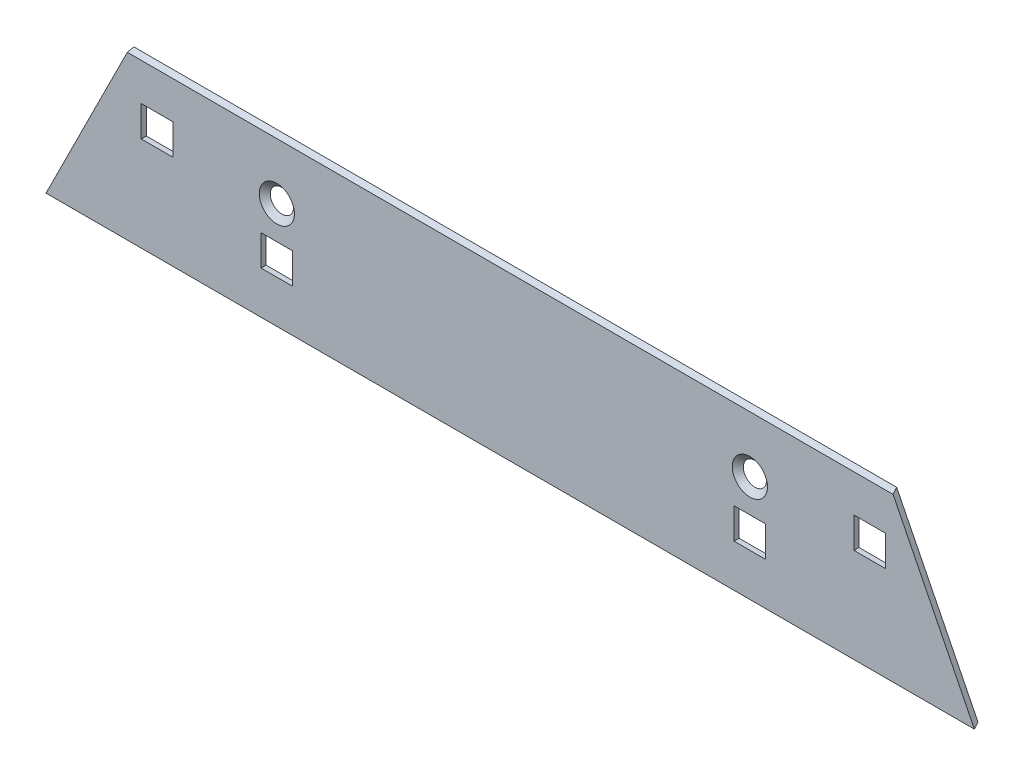
ISO-10303-21;
HEADER;
FILE_DESCRIPTION(('STEP AP214'),'2;1');
FILE_NAME('part.step','',(''),(''),'','','');
FILE_SCHEMA(('AUTOMOTIVE_DESIGN { 1 0 10303 214 1 1 1 1 }'));
ENDSEC;
DATA;
#1=APPLICATION_CONTEXT('core data for automotive mechanical design processes');
#2=APPLICATION_PROTOCOL_DEFINITION('international standard','automotive_design',2000,#1);
#3=PRODUCT_CONTEXT('',#1,'mechanical');
#4=PRODUCT('Part','Part','',(#3));
#5=PRODUCT_RELATED_PRODUCT_CATEGORY('part','',(#4));
#6=PRODUCT_DEFINITION_FORMATION('','',#4);
#7=PRODUCT_DEFINITION_CONTEXT('part definition',#1,'design');
#8=PRODUCT_DEFINITION('design','',#6,#7);
#9=PRODUCT_DEFINITION_SHAPE('','',#8);
#10=(LENGTH_UNIT() NAMED_UNIT(*) SI_UNIT(.MILLI.,.METRE.));
#11=(NAMED_UNIT(*) PLANE_ANGLE_UNIT() SI_UNIT($,.RADIAN.));
#12=(NAMED_UNIT(*) SI_UNIT($,.STERADIAN.) SOLID_ANGLE_UNIT());
#13=UNCERTAINTY_MEASURE_WITH_UNIT(LENGTH_MEASURE(1.E-05),#10,'distance_accuracy_value','');
#14=(GEOMETRIC_REPRESENTATION_CONTEXT(3) GLOBAL_UNCERTAINTY_ASSIGNED_CONTEXT((#13)) GLOBAL_UNIT_ASSIGNED_CONTEXT((#10,
#11,#12)) REPRESENTATION_CONTEXT('',''));
#15=CARTESIAN_POINT('',(0.,0.,0.));
#16=DIRECTION('',(0.,0.,1.));
#17=DIRECTION('',(1.,0.,0.));
#18=AXIS2_PLACEMENT_3D('',#15,#16,#17);
#19=CARTESIAN_POINT('',(186.944,-1.33086780534522,0.5715));
#20=DIRECTION('',(0.,0.,1.));
#21=DIRECTION('',(1.,0.,0.));
#22=AXIS2_PLACEMENT_3D('',#19,#20,#21);
#23=PLANE('',#22);
#24=CARTESIAN_POINT('',(46.4819999999999,19.4866540538976,0.5715));
#25=DIRECTION('',(0.,0.,1.));
#26=DIRECTION('',(1.,0.,0.));
#27=AXIS2_PLACEMENT_3D('',#24,#25,#26);
#28=CIRCLE('',#27,2.33247834992428);
#29=CARTESIAN_POINT('',(48.8144783499241,19.4866540538976,0.5715));
#30=VERTEX_POINT('',#29);
#31=EDGE_CURVE('E367',#30,#30,#28,.T.);
#32=ORIENTED_EDGE('',*,*,#31,.T.);
#33=EDGE_LOOP('',(#32));
#34=FACE_BOUND('',#33,.T.);
#35=CARTESIAN_POINT('',(141.732,19.4866540538976,0.5715));
#36=DIRECTION('',(0.,0.,1.));
#37=DIRECTION('',(1.,0.,0.));
#38=AXIS2_PLACEMENT_3D('',#35,#36,#37);
#39=CIRCLE('',#38,2.33247834992428);
#40=CARTESIAN_POINT('',(144.064478349924,19.4866540538976,0.5715));
#41=VERTEX_POINT('',#40);
#42=EDGE_CURVE('E191',#41,#41,#39,.T.);
#43=ORIENTED_EDGE('',*,*,#42,.T.);
#44=EDGE_LOOP('',(#43));
#45=FACE_BOUND('',#44,.T.);
#46=DIRECTION('',(0.,1.,0.));
#47=VECTOR('',#46,1.);
#48=CARTESIAN_POINT('',(169.037,17.1244540538976,0.5715));
#49=LINE('',#48,#47);
#50=CARTESIAN_POINT('',(169.037,17.1244540538976,0.5715));
#51=VERTEX_POINT('',#50);
#52=CARTESIAN_POINT('',(169.037,23.2966540538976,0.5715));
#53=VERTEX_POINT('',#52);
#54=EDGE_CURVE('E176',#51,#53,#49,.T.);
#55=ORIENTED_EDGE('',*,*,#54,.T.);
#56=DIRECTION('',(-1.,0.,0.));
#57=VECTOR('',#56,1.);
#58=CARTESIAN_POINT('',(169.037,23.2966540538976,0.5715));
#59=LINE('',#58,#57);
#60=CARTESIAN_POINT('',(162.687,23.2966540538976,0.5715));
#61=VERTEX_POINT('',#60);
#62=EDGE_CURVE('E170',#53,#61,#59,.T.);
#63=ORIENTED_EDGE('',*,*,#62,.T.);
#64=DIRECTION('',(0.,-1.,0.));
#65=VECTOR('',#64,1.);
#66=CARTESIAN_POINT('',(162.687,23.2966540538976,0.5715));
#67=LINE('',#66,#65);
#68=CARTESIAN_POINT('',(162.687,17.1244540538976,0.5715));
#69=VERTEX_POINT('',#68);
#70=EDGE_CURVE('E179',#61,#69,#67,.T.);
#71=ORIENTED_EDGE('',*,*,#70,.T.);
#72=DIRECTION('',(1.,0.,0.));
#73=VECTOR('',#72,1.);
#74=CARTESIAN_POINT('',(162.687,17.1244540538976,0.5715));
#75=LINE('',#74,#73);
#76=EDGE_CURVE('E47',#69,#51,#75,.T.);
#77=ORIENTED_EDGE('',*,*,#76,.T.);
#78=EDGE_LOOP('',(#55,#63,#71,#77));
#79=FACE_BOUND('',#78,.T.);
#80=DIRECTION('',(1.,0.,0.));
#81=VECTOR('',#80,1.);
#82=CARTESIAN_POINT('',(138.557,6.6672603790645,0.5715));
#83=LINE('',#82,#81);
#84=CARTESIAN_POINT('',(138.557,6.6672603790645,0.5715));
#85=VERTEX_POINT('',#84);
#86=CARTESIAN_POINT('',(144.907,6.6672603790645,0.5715));
#87=VERTEX_POINT('',#86);
#88=EDGE_CURVE('E217',#85,#87,#83,.T.);
#89=ORIENTED_EDGE('',*,*,#88,.T.);
#90=DIRECTION('',(0.,1.,0.));
#91=VECTOR('',#90,1.);
#92=CARTESIAN_POINT('',(144.907,6.6672603790645,0.5715));
#93=LINE('',#92,#91);
#94=CARTESIAN_POINT('',(144.907,12.8394603790645,0.5715));
#95=VERTEX_POINT('',#94);
#96=EDGE_CURVE('E207',#87,#95,#93,.T.);
#97=ORIENTED_EDGE('',*,*,#96,.T.);
#98=DIRECTION('',(-1.,0.,0.));
#99=VECTOR('',#98,1.);
#100=CARTESIAN_POINT('',(144.907,12.8394603790645,0.5715));
#101=LINE('',#100,#99);
#102=CARTESIAN_POINT('',(138.557,12.8394603790645,0.5715));
#103=VERTEX_POINT('',#102);
#104=EDGE_CURVE('E210',#95,#103,#101,.T.);
#105=ORIENTED_EDGE('',*,*,#104,.T.);
#106=DIRECTION('',(0.,-1.,0.));
#107=VECTOR('',#106,1.);
#108=CARTESIAN_POINT('',(138.557,12.8394603790645,0.5715));
#109=LINE('',#108,#107);
#110=EDGE_CURVE('E214',#103,#85,#109,.T.);
#111=ORIENTED_EDGE('',*,*,#110,.T.);
#112=EDGE_LOOP('',(#89,#97,#105,#111));
#113=FACE_BOUND('',#112,.T.);
#114=DIRECTION('',(0.,1.,0.));
#115=VECTOR('',#114,1.);
#116=CARTESIAN_POINT('',(49.6569999999998,6.6672603790645,0.5715));
#117=LINE('',#116,#115);
#118=CARTESIAN_POINT('',(49.6569999999998,6.6672603790645,0.5715));
#119=VERTEX_POINT('',#118);
#120=CARTESIAN_POINT('',(49.6569999999998,12.8394603790645,0.5715));
#121=VERTEX_POINT('',#120);
#122=EDGE_CURVE('E249',#119,#121,#117,.T.);
#123=ORIENTED_EDGE('',*,*,#122,.T.);
#124=DIRECTION('',(-1.,0.,0.));
#125=VECTOR('',#124,1.);
#126=CARTESIAN_POINT('',(49.6569999999998,12.8394603790645,0.5715));
#127=LINE('',#126,#125);
#128=CARTESIAN_POINT('',(43.3069999999998,12.8394603790645,0.5715));
#129=VERTEX_POINT('',#128);
#130=EDGE_CURVE('E239',#121,#129,#127,.T.);
#131=ORIENTED_EDGE('',*,*,#130,.T.);
#132=DIRECTION('',(0.,-1.,0.));
#133=VECTOR('',#132,1.);
#134=CARTESIAN_POINT('',(43.3069999999998,12.8394603790645,0.5715));
#135=LINE('',#134,#133);
#136=CARTESIAN_POINT('',(43.3069999999998,6.6672603790645,0.5715));
#137=VERTEX_POINT('',#136);
#138=EDGE_CURVE('E242',#129,#137,#135,.T.);
#139=ORIENTED_EDGE('',*,*,#138,.T.);
#140=DIRECTION('',(1.,0.,0.));
#141=VECTOR('',#140,1.);
#142=CARTESIAN_POINT('',(43.3069999999998,6.6672603790645,0.5715));
#143=LINE('',#142,#141);
#144=EDGE_CURVE('E246',#137,#119,#143,.T.);
#145=ORIENTED_EDGE('',*,*,#144,.T.);
#146=EDGE_LOOP('',(#123,#131,#139,#145));
#147=FACE_BOUND('',#146,.T.);
#148=DIRECTION('',(1.,0.,0.));
#149=VECTOR('',#148,1.);
#150=CARTESIAN_POINT('',(19.1769999999995,17.1244540538966,0.5715));
#151=LINE('',#150,#149);
#152=CARTESIAN_POINT('',(19.1769999999995,17.1244540538966,0.5715));
#153=VERTEX_POINT('',#152);
#154=CARTESIAN_POINT('',(25.5269999999995,17.1244540538966,0.5715));
#155=VERTEX_POINT('',#154);
#156=EDGE_CURVE('E281',#153,#155,#151,.T.);
#157=ORIENTED_EDGE('',*,*,#156,.T.);
#158=DIRECTION('',(0.,1.,0.));
#159=VECTOR('',#158,1.);
#160=CARTESIAN_POINT('',(25.5269999999995,17.1244540538966,0.5715));
#161=LINE('',#160,#159);
#162=CARTESIAN_POINT('',(25.5269999999995,23.2966540538966,0.5715));
#163=VERTEX_POINT('',#162);
#164=EDGE_CURVE('E271',#155,#163,#161,.T.);
#165=ORIENTED_EDGE('',*,*,#164,.T.);
#166=DIRECTION('',(-1.,0.,0.));
#167=VECTOR('',#166,1.);
#168=CARTESIAN_POINT('',(25.5269999999995,23.2966540538966,0.5715));
#169=LINE('',#168,#167);
#170=CARTESIAN_POINT('',(19.1769999999995,23.2966540538966,0.5715));
#171=VERTEX_POINT('',#170);
#172=EDGE_CURVE('E274',#163,#171,#169,.T.);
#173=ORIENTED_EDGE('',*,*,#172,.T.);
#174=DIRECTION('',(0.,-1.,0.));
#175=VECTOR('',#174,1.);
#176=CARTESIAN_POINT('',(19.1769999999995,23.2966540538966,0.5715));
#177=LINE('',#176,#175);
#178=EDGE_CURVE('E278',#171,#153,#177,.T.);
#179=ORIENTED_EDGE('',*,*,#178,.T.);
#180=EDGE_LOOP('',(#157,#165,#173,#179));
#181=FACE_BOUND('',#180,.T.);
#182=DIRECTION('',(-1.,0.,0.));
#183=VECTOR('',#182,1.);
#184=CARTESIAN_POINT('',(186.944,31.4200443211581,0.5715));
#185=LINE('',#184,#183);
#186=CARTESIAN_POINT('',(170.271650509094,31.4200443211581,0.5715));
#187=VERTEX_POINT('',#186);
#188=CARTESIAN_POINT('',(16.6723494909062,31.4200443211581,0.5715));
#189=VERTEX_POINT('',#188);
#190=EDGE_CURVE('E11',#187,#189,#185,.T.);
#191=ORIENTED_EDGE('',*,*,#190,.F.);
#192=DIRECTION('',(0.447290848418705,-0.894388560370086,0.));
#193=VECTOR('',#192,1.);
#194=CARTESIAN_POINT('',(170.271650509094,31.4200443211581,0.5715));
#195=LINE('',#194,#193);
#196=CARTESIAN_POINT('',(186.650642728637,-1.33086780534522,0.5715));
#197=VERTEX_POINT('',#196);
#198=EDGE_CURVE('E303',#187,#197,#195,.T.);
#199=ORIENTED_EDGE('',*,*,#198,.T.);
#200=DIRECTION('',(-1.,0.,0.));
#201=VECTOR('',#200,1.);
#202=CARTESIAN_POINT('',(186.944,-1.33086780534522,0.5715));
#203=LINE('',#202,#201);
#204=CARTESIAN_POINT('',(0.293357271362982,-1.33086780534522,0.5715));
#205=VERTEX_POINT('',#204);
#206=EDGE_CURVE('E325',#197,#205,#203,.T.);
#207=ORIENTED_EDGE('',*,*,#206,.T.);
#208=DIRECTION('',(0.447290848418704,0.894388560370086,0.));
#209=VECTOR('',#208,1.);
#210=CARTESIAN_POINT('',(0.,-1.91745567884188,0.5715));
#211=LINE('',#210,#209);
#212=EDGE_CURVE('E314',#205,#189,#211,.T.);
#213=ORIENTED_EDGE('',*,*,#212,.T.);
#214=EDGE_LOOP('',(#191,#199,#207,#213));
#215=FACE_BOUND('',#214,.T.);
#216=ADVANCED_FACE('F33',(#34,#45,#79,#113,#147,#181,#215),#23,.F.);
#217=CARTESIAN_POINT('',(186.944,31.4200443211581,0.5715));
#218=DIRECTION('',(0.,-0.866025403784435,-0.500000000000006));
#219=DIRECTION('',(0.,0.500000000000006,-0.866025403784435));
#220=AXIS2_PLACEMENT_3D('',#217,#218,#219);
#221=PLANE('',#220);
#222=DIRECTION('',(-1.,0.,0.));
#223=VECTOR('',#222,1.);
#224=CARTESIAN_POINT('',(186.944,30.8334564476615,1.5875));
#225=LINE('',#224,#223);
#226=CARTESIAN_POINT('',(170.565007780457,30.8334564476615,1.5875));
#227=VERTEX_POINT('',#226);
#228=CARTESIAN_POINT('',(16.3789922195432,30.8334564476614,1.5875));
#229=VERTEX_POINT('',#228);
#230=EDGE_CURVE('E40',#227,#229,#225,.T.);
#231=ORIENTED_EDGE('',*,*,#230,.F.);
#232=DIRECTION('',(-0.242584917028732,0.485065087908361,-0.840157377235132));
#233=VECTOR('',#232,1.);
#234=CARTESIAN_POINT('',(171.252775628261,29.4582177244887,3.96948334107134));
#235=LINE('',#234,#233);
#236=EDGE_CURVE('E310',#227,#187,#235,.T.);
#237=ORIENTED_EDGE('',*,*,#236,.T.);
#238=ORIENTED_EDGE('',*,*,#190,.T.);
#239=DIRECTION('',(-0.242584917028732,-0.485065087908362,0.840157377235133));
#240=VECTOR('',#239,1.);
#241=CARTESIAN_POINT('',(26.6924005633484,51.4558198913466,-34.1314812566131));
#242=LINE('',#241,#240);
#243=EDGE_CURVE('E322',#189,#229,#242,.T.);
#244=ORIENTED_EDGE('',*,*,#243,.T.);
#245=EDGE_LOOP('',(#231,#237,#238,#244));
#246=FACE_BOUND('',#245,.T.);
#247=ADVANCED_FACE('F340',(#246),#221,.F.);
#248=CARTESIAN_POINT('',(186.944,-1.91745567884188,1.5875));
#249=DIRECTION('',(0.,0.,-1.));
#250=DIRECTION('',(0.,1.,0.));
#251=AXIS2_PLACEMENT_3D('',#248,#249,#250);
#252=PLANE('',#251);
#253=CARTESIAN_POINT('',(46.4819999999999,19.4866540538976,1.5875));
#254=DIRECTION('',(0.,0.,1.));
#255=DIRECTION('',(1.,0.,0.));
#256=AXIS2_PLACEMENT_3D('',#253,#254,#255);
#257=CIRCLE('',#256,3.5433);
#258=CARTESIAN_POINT('',(50.0252999999999,19.4866540538976,1.5875));
#259=VERTEX_POINT('',#258);
#260=EDGE_CURVE('E375',#259,#259,#257,.T.);
#261=ORIENTED_EDGE('',*,*,#260,.F.);
#262=EDGE_LOOP('',(#261));
#263=FACE_BOUND('',#262,.T.);
#264=CARTESIAN_POINT('',(141.732,19.4866540538976,1.5875));
#265=DIRECTION('',(0.,0.,1.));
#266=DIRECTION('',(1.,0.,0.));
#267=AXIS2_PLACEMENT_3D('',#264,#265,#266);
#268=CIRCLE('',#267,3.5433);
#269=CARTESIAN_POINT('',(145.2753,19.4866540538976,1.5875));
#270=VERTEX_POINT('',#269);
#271=EDGE_CURVE('E371',#270,#270,#268,.T.);
#272=ORIENTED_EDGE('',*,*,#271,.F.);
#273=EDGE_LOOP('',(#272));
#274=FACE_BOUND('',#273,.T.);
#275=DIRECTION('',(0.,-1.,0.));
#276=VECTOR('',#275,1.);
#277=CARTESIAN_POINT('',(162.687,23.2966540538976,1.5875));
#278=LINE('',#277,#276);
#279=CARTESIAN_POINT('',(162.687,23.2966540538976,1.5875));
#280=VERTEX_POINT('',#279);
#281=CARTESIAN_POINT('',(162.687,17.1244540538976,1.5875));
#282=VERTEX_POINT('',#281);
#283=EDGE_CURVE('E197',#280,#282,#278,.T.);
#284=ORIENTED_EDGE('',*,*,#283,.F.);
#285=DIRECTION('',(-1.,0.,0.));
#286=VECTOR('',#285,1.);
#287=CARTESIAN_POINT('',(169.037,23.2966540538976,1.5875));
#288=LINE('',#287,#286);
#289=CARTESIAN_POINT('',(169.037,23.2966540538976,1.5875));
#290=VERTEX_POINT('',#289);
#291=EDGE_CURVE('E55',#290,#280,#288,.T.);
#292=ORIENTED_EDGE('',*,*,#291,.F.);
#293=DIRECTION('',(0.,1.,0.));
#294=VECTOR('',#293,1.);
#295=CARTESIAN_POINT('',(169.037,17.1244540538976,1.5875));
#296=LINE('',#295,#294);
#297=CARTESIAN_POINT('',(169.037,17.1244540538976,1.5875));
#298=VERTEX_POINT('',#297);
#299=EDGE_CURVE('E185',#298,#290,#296,.T.);
#300=ORIENTED_EDGE('',*,*,#299,.F.);
#301=DIRECTION('',(1.,0.,0.));
#302=VECTOR('',#301,1.);
#303=CARTESIAN_POINT('',(162.687,17.1244540538976,1.5875));
#304=LINE('',#303,#302);
#305=EDGE_CURVE('E188',#282,#298,#304,.T.);
#306=ORIENTED_EDGE('',*,*,#305,.F.);
#307=EDGE_LOOP('',(#284,#292,#300,#306));
#308=FACE_BOUND('',#307,.T.);
#309=DIRECTION('',(-1.,0.,0.));
#310=VECTOR('',#309,1.);
#311=CARTESIAN_POINT('',(144.907,12.8394603790645,1.5875));
#312=LINE('',#311,#310);
#313=CARTESIAN_POINT('',(144.907,12.8394603790645,1.5875));
#314=VERTEX_POINT('',#313);
#315=CARTESIAN_POINT('',(138.557,12.8394603790645,1.5875));
#316=VERTEX_POINT('',#315);
#317=EDGE_CURVE('E222',#314,#316,#312,.T.);
#318=ORIENTED_EDGE('',*,*,#317,.F.);
#319=DIRECTION('',(0.,1.,0.));
#320=VECTOR('',#319,1.);
#321=CARTESIAN_POINT('',(144.907,6.6672603790645,1.5875));
#322=LINE('',#321,#320);
#323=CARTESIAN_POINT('',(144.907,6.6672603790645,1.5875));
#324=VERTEX_POINT('',#323);
#325=EDGE_CURVE('E203',#324,#314,#322,.T.);
#326=ORIENTED_EDGE('',*,*,#325,.F.);
#327=DIRECTION('',(1.,0.,0.));
#328=VECTOR('',#327,1.);
#329=CARTESIAN_POINT('',(138.557,6.6672603790645,1.5875));
#330=LINE('',#329,#328);
#331=CARTESIAN_POINT('',(138.557,6.6672603790645,1.5875));
#332=VERTEX_POINT('',#331);
#333=EDGE_CURVE('E211',#332,#324,#330,.T.);
#334=ORIENTED_EDGE('',*,*,#333,.F.);
#335=DIRECTION('',(0.,-1.,0.));
#336=VECTOR('',#335,1.);
#337=CARTESIAN_POINT('',(138.557,12.8394603790645,1.5875));
#338=LINE('',#337,#336);
#339=EDGE_CURVE('E225',#316,#332,#338,.T.);
#340=ORIENTED_EDGE('',*,*,#339,.F.);
#341=EDGE_LOOP('',(#318,#326,#334,#340));
#342=FACE_BOUND('',#341,.T.);
#343=DIRECTION('',(0.,-1.,0.));
#344=VECTOR('',#343,1.);
#345=CARTESIAN_POINT('',(43.3069999999998,12.8394603790645,1.5875));
#346=LINE('',#345,#344);
#347=CARTESIAN_POINT('',(43.3069999999998,12.8394603790645,1.5875));
#348=VERTEX_POINT('',#347);
#349=CARTESIAN_POINT('',(43.3069999999998,6.6672603790645,1.5875));
#350=VERTEX_POINT('',#349);
#351=EDGE_CURVE('E254',#348,#350,#346,.T.);
#352=ORIENTED_EDGE('',*,*,#351,.F.);
#353=DIRECTION('',(-1.,0.,0.));
#354=VECTOR('',#353,1.);
#355=CARTESIAN_POINT('',(49.6569999999998,12.8394603790645,1.5875));
#356=LINE('',#355,#354);
#357=CARTESIAN_POINT('',(49.6569999999998,12.8394603790645,1.5875));
#358=VERTEX_POINT('',#357);
#359=EDGE_CURVE('E232',#358,#348,#356,.T.);
#360=ORIENTED_EDGE('',*,*,#359,.F.);
#361=DIRECTION('',(0.,1.,0.));
#362=VECTOR('',#361,1.);
#363=CARTESIAN_POINT('',(49.6569999999998,6.6672603790645,1.5875));
#364=LINE('',#363,#362);
#365=CARTESIAN_POINT('',(49.6569999999998,6.6672603790645,1.5875));
#366=VERTEX_POINT('',#365);
#367=EDGE_CURVE('E243',#366,#358,#364,.T.);
#368=ORIENTED_EDGE('',*,*,#367,.F.);
#369=DIRECTION('',(1.,0.,0.));
#370=VECTOR('',#369,1.);
#371=CARTESIAN_POINT('',(43.3069999999998,6.6672603790645,1.5875));
#372=LINE('',#371,#370);
#373=EDGE_CURVE('E257',#350,#366,#372,.T.);
#374=ORIENTED_EDGE('',*,*,#373,.F.);
#375=EDGE_LOOP('',(#352,#360,#368,#374));
#376=FACE_BOUND('',#375,.T.);
#377=DIRECTION('',(-1.,0.,0.));
#378=VECTOR('',#377,1.);
#379=CARTESIAN_POINT('',(25.5269999999995,23.2966540538966,1.5875));
#380=LINE('',#379,#378);
#381=CARTESIAN_POINT('',(25.5269999999995,23.2966540538966,1.5875));
#382=VERTEX_POINT('',#381);
#383=CARTESIAN_POINT('',(19.1769999999995,23.2966540538966,1.5875));
#384=VERTEX_POINT('',#383);
#385=EDGE_CURVE('E286',#382,#384,#380,.T.);
#386=ORIENTED_EDGE('',*,*,#385,.F.);
#387=DIRECTION('',(0.,1.,0.));
#388=VECTOR('',#387,1.);
#389=CARTESIAN_POINT('',(25.5269999999995,17.1244540538966,1.5875));
#390=LINE('',#389,#388);
#391=CARTESIAN_POINT('',(25.5269999999995,17.1244540538966,1.5875));
#392=VERTEX_POINT('',#391);
#393=EDGE_CURVE('E264',#392,#382,#390,.T.);
#394=ORIENTED_EDGE('',*,*,#393,.F.);
#395=DIRECTION('',(1.,0.,0.));
#396=VECTOR('',#395,1.);
#397=CARTESIAN_POINT('',(19.1769999999995,17.1244540538966,1.5875));
#398=LINE('',#397,#396);
#399=CARTESIAN_POINT('',(19.1769999999995,17.1244540538966,1.5875));
#400=VERTEX_POINT('',#399);
#401=EDGE_CURVE('E275',#400,#392,#398,.T.);
#402=ORIENTED_EDGE('',*,*,#401,.F.);
#403=DIRECTION('',(0.,-1.,0.));
#404=VECTOR('',#403,1.);
#405=CARTESIAN_POINT('',(19.1769999999995,23.2966540538966,1.5875));
#406=LINE('',#405,#404);
#407=EDGE_CURVE('E289',#384,#400,#406,.T.);
#408=ORIENTED_EDGE('',*,*,#407,.F.);
#409=EDGE_LOOP('',(#386,#394,#402,#408));
#410=FACE_BOUND('',#409,.T.);
#411=DIRECTION('',(-1.,0.,0.));
#412=VECTOR('',#411,1.);
#413=CARTESIAN_POINT('',(186.944,-1.91745567884188,1.5875));
#414=LINE('',#413,#412);
#415=CARTESIAN_POINT('',(186.944,-1.91745567884188,1.5875));
#416=VERTEX_POINT('',#415);
#417=CARTESIAN_POINT('',(0.,-1.91745567884188,1.5875));
#418=VERTEX_POINT('',#417);
#419=EDGE_CURVE('E327',#416,#418,#414,.T.);
#420=ORIENTED_EDGE('',*,*,#419,.F.);
#421=DIRECTION('',(0.447290848418705,-0.894388560370086,0.));
#422=VECTOR('',#421,1.);
#423=CARTESIAN_POINT('',(170.271650509094,31.4200443211581,1.5875));
#424=LINE('',#423,#422);
#425=EDGE_CURVE('E296',#227,#416,#424,.T.);
#426=ORIENTED_EDGE('',*,*,#425,.F.);
#427=ORIENTED_EDGE('',*,*,#230,.T.);
#428=DIRECTION('',(0.447290848418704,0.894388560370086,0.));
#429=VECTOR('',#428,1.);
#430=CARTESIAN_POINT('',(0.,-1.91745567884188,1.5875));
#431=LINE('',#430,#429);
#432=EDGE_CURVE('E313',#418,#229,#431,.T.);
#433=ORIENTED_EDGE('',*,*,#432,.F.);
#434=EDGE_LOOP('',(#420,#426,#427,#433));
#435=FACE_BOUND('',#434,.T.);
#436=ADVANCED_FACE('F334',(#263,#274,#308,#342,#376,#410,#435),#252,.F.);
#437=CARTESIAN_POINT('',(186.944,-1.91745567884188,1.5875));
#438=DIRECTION('',(0.,0.86602540378444,0.499999999999998));
#439=DIRECTION('',(0.,-0.499999999999998,0.86602540378444));
#440=AXIS2_PLACEMENT_3D('',#437,#438,#439);
#441=PLANE('',#440);
#442=ORIENTED_EDGE('',*,*,#206,.F.);
#443=DIRECTION('',(0.242584917028728,-0.485065087908354,0.840157377235138));
#444=VECTOR('',#443,1.);
#445=CARTESIAN_POINT('',(186.944,-1.91745567884188,1.5875));
#446=LINE('',#445,#444);
#447=EDGE_CURVE('E306',#197,#416,#446,.T.);
#448=ORIENTED_EDGE('',*,*,#447,.T.);
#449=ORIENTED_EDGE('',*,*,#419,.T.);
#450=DIRECTION('',(0.242584917028728,0.485065087908354,-0.840157377235138));
#451=VECTOR('',#450,1.);
#452=CARTESIAN_POINT('',(11.0011761916088,20.0801464880153,-36.5134645976841));
#453=LINE('',#452,#451);
#454=EDGE_CURVE('E317',#418,#205,#453,.T.);
#455=ORIENTED_EDGE('',*,*,#454,.T.);
#456=EDGE_LOOP('',(#442,#448,#449,#455));
#457=FACE_BOUND('',#456,.T.);
#458=ADVANCED_FACE('F345',(#457),#441,.F.);
#459=CARTESIAN_POINT('',(0.,-1.91745567884188,0.5715));
#460=DIRECTION('',(0.894388560370086,-0.447290848418704,0.));
#461=DIRECTION('',(0.447290848418704,0.894388560370086,0.));
#462=AXIS2_PLACEMENT_3D('',#459,#460,#461);
#463=PLANE('',#462);
#464=ORIENTED_EDGE('',*,*,#212,.F.);
#465=ORIENTED_EDGE('',*,*,#454,.F.);
#466=ORIENTED_EDGE('',*,*,#432,.T.);
#467=ORIENTED_EDGE('',*,*,#243,.F.);
#468=EDGE_LOOP('',(#464,#465,#466,#467));
#469=FACE_BOUND('',#468,.T.);
#470=ADVANCED_FACE('F339',(#469),#463,.F.);
#471=CARTESIAN_POINT('',(170.271650509094,31.4200443211581,0.5715));
#472=DIRECTION('',(-0.894388560370086,-0.447290848418705,0.));
#473=DIRECTION('',(0.447290848418705,-0.894388560370086,0.));
#474=AXIS2_PLACEMENT_3D('',#471,#472,#473);
#475=PLANE('',#474);
#476=ORIENTED_EDGE('',*,*,#425,.T.);
#477=ORIENTED_EDGE('',*,*,#447,.F.);
#478=ORIENTED_EDGE('',*,*,#198,.F.);
#479=ORIENTED_EDGE('',*,*,#236,.F.);
#480=EDGE_LOOP('',(#476,#477,#478,#479));
#481=FACE_BOUND('',#480,.T.);
#482=ADVANCED_FACE('F347',(#481),#475,.F.);
#483=CARTESIAN_POINT('',(25.5269999999995,17.1244540538966,0.5715));
#484=DIRECTION('',(1.,0.,0.));
#485=DIRECTION('',(0.,0.,-1.));
#486=AXIS2_PLACEMENT_3D('',#483,#484,#485);
#487=PLANE('',#486);
#488=ORIENTED_EDGE('',*,*,#393,.T.);
#489=DIRECTION('',(0.,0.,1.));
#490=VECTOR('',#489,1.);
#491=CARTESIAN_POINT('',(25.5269999999995,23.2966540538966,0.5715));
#492=LINE('',#491,#490);
#493=EDGE_CURVE('E284',#163,#382,#492,.T.);
#494=ORIENTED_EDGE('',*,*,#493,.F.);
#495=ORIENTED_EDGE('',*,*,#164,.F.);
#496=DIRECTION('',(0.,0.,1.));
#497=VECTOR('',#496,1.);
#498=CARTESIAN_POINT('',(25.5269999999995,17.1244540538966,0.5715));
#499=LINE('',#498,#497);
#500=EDGE_CURVE('E294',#155,#392,#499,.T.);
#501=ORIENTED_EDGE('',*,*,#500,.T.);
#502=EDGE_LOOP('',(#488,#494,#495,#501));
#503=FACE_BOUND('',#502,.T.);
#504=ADVANCED_FACE('F349',(#503),#487,.F.);
#505=CARTESIAN_POINT('',(19.1769999999995,17.1244540538966,0.5715));
#506=DIRECTION('',(0.,-1.,0.));
#507=DIRECTION('',(0.,0.,-1.));
#508=AXIS2_PLACEMENT_3D('',#505,#506,#507);
#509=PLANE('',#508);
#510=ORIENTED_EDGE('',*,*,#401,.T.);
#511=ORIENTED_EDGE('',*,*,#500,.F.);
#512=ORIENTED_EDGE('',*,*,#156,.F.);
#513=DIRECTION('',(0.,0.,1.));
#514=VECTOR('',#513,1.);
#515=CARTESIAN_POINT('',(19.1769999999995,17.1244540538966,0.5715));
#516=LINE('',#515,#514);
#517=EDGE_CURVE('E297',#153,#400,#516,.T.);
#518=ORIENTED_EDGE('',*,*,#517,.T.);
#519=EDGE_LOOP('',(#510,#511,#512,#518));
#520=FACE_BOUND('',#519,.T.);
#521=ADVANCED_FACE('F355',(#520),#509,.F.);
#522=CARTESIAN_POINT('',(19.1769999999995,23.2966540538966,0.5715));
#523=DIRECTION('',(-1.,0.,0.));
#524=DIRECTION('',(0.,0.,1.));
#525=AXIS2_PLACEMENT_3D('',#522,#523,#524);
#526=PLANE('',#525);
#527=ORIENTED_EDGE('',*,*,#407,.T.);
#528=ORIENTED_EDGE('',*,*,#517,.F.);
#529=ORIENTED_EDGE('',*,*,#178,.F.);
#530=DIRECTION('',(0.,0.,1.));
#531=VECTOR('',#530,1.);
#532=CARTESIAN_POINT('',(19.1769999999995,23.2966540538966,0.5715));
#533=LINE('',#532,#531);
#534=EDGE_CURVE('E299',#171,#384,#533,.T.);
#535=ORIENTED_EDGE('',*,*,#534,.T.);
#536=EDGE_LOOP('',(#527,#528,#529,#535));
#537=FACE_BOUND('',#536,.T.);
#538=ADVANCED_FACE('F410',(#537),#526,.F.);
#539=CARTESIAN_POINT('',(25.5269999999995,23.2966540538966,0.5715));
#540=DIRECTION('',(0.,1.,0.));
#541=DIRECTION('',(0.,0.,1.));
#542=AXIS2_PLACEMENT_3D('',#539,#540,#541);
#543=PLANE('',#542);
#544=ORIENTED_EDGE('',*,*,#385,.T.);
#545=ORIENTED_EDGE('',*,*,#534,.F.);
#546=ORIENTED_EDGE('',*,*,#172,.F.);
#547=ORIENTED_EDGE('',*,*,#493,.T.);
#548=EDGE_LOOP('',(#544,#545,#546,#547));
#549=FACE_BOUND('',#548,.T.);
#550=ADVANCED_FACE('F404',(#549),#543,.F.);
#551=CARTESIAN_POINT('',(49.6569999999998,12.8394603790645,0.5715));
#552=DIRECTION('',(0.,1.,0.));
#553=DIRECTION('',(0.,0.,1.));
#554=AXIS2_PLACEMENT_3D('',#551,#552,#553);
#555=PLANE('',#554);
#556=ORIENTED_EDGE('',*,*,#359,.T.);
#557=DIRECTION('',(0.,0.,1.));
#558=VECTOR('',#557,1.);
#559=CARTESIAN_POINT('',(43.3069999999998,12.8394603790645,0.5715));
#560=LINE('',#559,#558);
#561=EDGE_CURVE('E252',#129,#348,#560,.T.);
#562=ORIENTED_EDGE('',*,*,#561,.F.);
#563=ORIENTED_EDGE('',*,*,#130,.F.);
#564=DIRECTION('',(0.,0.,1.));
#565=VECTOR('',#564,1.);
#566=CARTESIAN_POINT('',(49.6569999999998,12.8394603790645,0.5715));
#567=LINE('',#566,#565);
#568=EDGE_CURVE('E262',#121,#358,#567,.T.);
#569=ORIENTED_EDGE('',*,*,#568,.T.);
#570=EDGE_LOOP('',(#556,#562,#563,#569));
#571=FACE_BOUND('',#570,.T.);
#572=ADVANCED_FACE('F418',(#571),#555,.F.);
#573=CARTESIAN_POINT('',(49.6569999999998,6.6672603790645,0.5715));
#574=DIRECTION('',(1.,0.,0.));
#575=DIRECTION('',(0.,0.,-1.));
#576=AXIS2_PLACEMENT_3D('',#573,#574,#575);
#577=PLANE('',#576);
#578=ORIENTED_EDGE('',*,*,#367,.T.);
#579=ORIENTED_EDGE('',*,*,#568,.F.);
#580=ORIENTED_EDGE('',*,*,#122,.F.);
#581=DIRECTION('',(0.,0.,1.));
#582=VECTOR('',#581,1.);
#583=CARTESIAN_POINT('',(49.6569999999998,6.6672603790645,0.5715));
#584=LINE('',#583,#582);
#585=EDGE_CURVE('E265',#119,#366,#584,.T.);
#586=ORIENTED_EDGE('',*,*,#585,.T.);
#587=EDGE_LOOP('',(#578,#579,#580,#586));
#588=FACE_BOUND('',#587,.T.);
#589=ADVANCED_FACE('F424',(#588),#577,.F.);
#590=CARTESIAN_POINT('',(43.3069999999998,6.6672603790645,0.5715));
#591=DIRECTION('',(0.,-1.,0.));
#592=DIRECTION('',(0.,0.,-1.));
#593=AXIS2_PLACEMENT_3D('',#590,#591,#592);
#594=PLANE('',#593);
#595=ORIENTED_EDGE('',*,*,#373,.T.);
#596=ORIENTED_EDGE('',*,*,#585,.F.);
#597=ORIENTED_EDGE('',*,*,#144,.F.);
#598=DIRECTION('',(0.,0.,1.));
#599=VECTOR('',#598,1.);
#600=CARTESIAN_POINT('',(43.3069999999998,6.6672603790645,0.5715));
#601=LINE('',#600,#599);
#602=EDGE_CURVE('E267',#137,#350,#601,.T.);
#603=ORIENTED_EDGE('',*,*,#602,.T.);
#604=EDGE_LOOP('',(#595,#596,#597,#603));
#605=FACE_BOUND('',#604,.T.);
#606=ADVANCED_FACE('F430',(#605),#594,.F.);
#607=CARTESIAN_POINT('',(43.3069999999998,12.8394603790645,0.5715));
#608=DIRECTION('',(-1.,0.,0.));
#609=DIRECTION('',(0.,0.,1.));
#610=AXIS2_PLACEMENT_3D('',#607,#608,#609);
#611=PLANE('',#610);
#612=ORIENTED_EDGE('',*,*,#351,.T.);
#613=ORIENTED_EDGE('',*,*,#602,.F.);
#614=ORIENTED_EDGE('',*,*,#138,.F.);
#615=ORIENTED_EDGE('',*,*,#561,.T.);
#616=EDGE_LOOP('',(#612,#613,#614,#615));
#617=FACE_BOUND('',#616,.T.);
#618=ADVANCED_FACE('F426',(#617),#611,.F.);
#619=CARTESIAN_POINT('',(144.907,6.6672603790645,0.5715));
#620=DIRECTION('',(1.,0.,0.));
#621=DIRECTION('',(0.,0.,-1.));
#622=AXIS2_PLACEMENT_3D('',#619,#620,#621);
#623=PLANE('',#622);
#624=ORIENTED_EDGE('',*,*,#325,.T.);
#625=DIRECTION('',(0.,0.,1.));
#626=VECTOR('',#625,1.);
#627=CARTESIAN_POINT('',(144.907,12.8394603790645,0.5715));
#628=LINE('',#627,#626);
#629=EDGE_CURVE('E220',#95,#314,#628,.T.);
#630=ORIENTED_EDGE('',*,*,#629,.F.);
#631=ORIENTED_EDGE('',*,*,#96,.F.);
#632=DIRECTION('',(0.,0.,1.));
#633=VECTOR('',#632,1.);
#634=CARTESIAN_POINT('',(144.907,6.6672603790645,0.5715));
#635=LINE('',#634,#633);
#636=EDGE_CURVE('E230',#87,#324,#635,.T.);
#637=ORIENTED_EDGE('',*,*,#636,.T.);
#638=EDGE_LOOP('',(#624,#630,#631,#637));
#639=FACE_BOUND('',#638,.T.);
#640=ADVANCED_FACE('F429',(#639),#623,.F.);
#641=CARTESIAN_POINT('',(138.557,6.6672603790645,0.5715));
#642=DIRECTION('',(0.,-1.,0.));
#643=DIRECTION('',(0.,0.,-1.));
#644=AXIS2_PLACEMENT_3D('',#641,#642,#643);
#645=PLANE('',#644);
#646=ORIENTED_EDGE('',*,*,#333,.T.);
#647=ORIENTED_EDGE('',*,*,#636,.F.);
#648=ORIENTED_EDGE('',*,*,#88,.F.);
#649=DIRECTION('',(0.,0.,1.));
#650=VECTOR('',#649,1.);
#651=CARTESIAN_POINT('',(138.557,6.6672603790645,0.5715));
#652=LINE('',#651,#650);
#653=EDGE_CURVE('E233',#85,#332,#652,.T.);
#654=ORIENTED_EDGE('',*,*,#653,.T.);
#655=EDGE_LOOP('',(#646,#647,#648,#654));
#656=FACE_BOUND('',#655,.T.);
#657=ADVANCED_FACE('F440',(#656),#645,.F.);
#658=CARTESIAN_POINT('',(138.557,12.8394603790645,0.5715));
#659=DIRECTION('',(-1.,0.,0.));
#660=DIRECTION('',(0.,0.,1.));
#661=AXIS2_PLACEMENT_3D('',#658,#659,#660);
#662=PLANE('',#661);
#663=ORIENTED_EDGE('',*,*,#339,.T.);
#664=ORIENTED_EDGE('',*,*,#653,.F.);
#665=ORIENTED_EDGE('',*,*,#110,.F.);
#666=DIRECTION('',(0.,0.,1.));
#667=VECTOR('',#666,1.);
#668=CARTESIAN_POINT('',(138.557,12.8394603790645,0.5715));
#669=LINE('',#668,#667);
#670=EDGE_CURVE('E235',#103,#316,#669,.T.);
#671=ORIENTED_EDGE('',*,*,#670,.T.);
#672=EDGE_LOOP('',(#663,#664,#665,#671));
#673=FACE_BOUND('',#672,.T.);
#674=ADVANCED_FACE('F445',(#673),#662,.F.);
#675=CARTESIAN_POINT('',(144.907,12.8394603790645,0.5715));
#676=DIRECTION('',(0.,1.,0.));
#677=DIRECTION('',(-1.,0.,0.));
#678=AXIS2_PLACEMENT_3D('',#675,#676,#677);
#679=PLANE('',#678);
#680=ORIENTED_EDGE('',*,*,#317,.T.);
#681=ORIENTED_EDGE('',*,*,#670,.F.);
#682=ORIENTED_EDGE('',*,*,#104,.F.);
#683=ORIENTED_EDGE('',*,*,#629,.T.);
#684=EDGE_LOOP('',(#680,#681,#682,#683));
#685=FACE_BOUND('',#684,.T.);
#686=ADVANCED_FACE('F442',(#685),#679,.F.);
#687=CARTESIAN_POINT('',(169.037,23.2966540538976,0.5715));
#688=DIRECTION('',(0.,1.,0.));
#689=DIRECTION('',(0.,0.,1.));
#690=AXIS2_PLACEMENT_3D('',#687,#688,#689);
#691=PLANE('',#690);
#692=ORIENTED_EDGE('',*,*,#291,.T.);
#693=DIRECTION('',(0.,0.,1.));
#694=VECTOR('',#693,1.);
#695=CARTESIAN_POINT('',(162.687,23.2966540538976,0.5715));
#696=LINE('',#695,#694);
#697=EDGE_CURVE('E166',#61,#280,#696,.T.);
#698=ORIENTED_EDGE('',*,*,#697,.F.);
#699=ORIENTED_EDGE('',*,*,#62,.F.);
#700=DIRECTION('',(0.,0.,1.));
#701=VECTOR('',#700,1.);
#702=CARTESIAN_POINT('',(169.037,23.2966540538976,0.5715));
#703=LINE('',#702,#701);
#704=EDGE_CURVE('E201',#53,#290,#703,.T.);
#705=ORIENTED_EDGE('',*,*,#704,.T.);
#706=EDGE_LOOP('',(#692,#698,#699,#705));
#707=FACE_BOUND('',#706,.T.);
#708=ADVANCED_FACE('F168',(#707),#691,.F.);
#709=CARTESIAN_POINT('',(169.037,17.1244540538976,0.5715));
#710=DIRECTION('',(1.,0.,0.));
#711=DIRECTION('',(0.,0.,-1.));
#712=AXIS2_PLACEMENT_3D('',#709,#710,#711);
#713=PLANE('',#712);
#714=ORIENTED_EDGE('',*,*,#299,.T.);
#715=ORIENTED_EDGE('',*,*,#704,.F.);
#716=ORIENTED_EDGE('',*,*,#54,.F.);
#717=DIRECTION('',(0.,0.,1.));
#718=VECTOR('',#717,1.);
#719=CARTESIAN_POINT('',(169.037,17.1244540538976,0.5715));
#720=LINE('',#719,#718);
#721=EDGE_CURVE('E204',#51,#298,#720,.T.);
#722=ORIENTED_EDGE('',*,*,#721,.T.);
#723=EDGE_LOOP('',(#714,#715,#716,#722));
#724=FACE_BOUND('',#723,.T.);
#725=ADVANCED_FACE('F455',(#724),#713,.F.);
#726=CARTESIAN_POINT('',(162.687,17.1244540538976,0.5715));
#727=DIRECTION('',(0.,-1.,0.));
#728=DIRECTION('',(0.,0.,-1.));
#729=AXIS2_PLACEMENT_3D('',#726,#727,#728);
#730=PLANE('',#729);
#731=ORIENTED_EDGE('',*,*,#305,.T.);
#732=ORIENTED_EDGE('',*,*,#721,.F.);
#733=ORIENTED_EDGE('',*,*,#76,.F.);
#734=DIRECTION('',(0.,0.,1.));
#735=VECTOR('',#734,1.);
#736=CARTESIAN_POINT('',(162.687,17.1244540538976,0.5715));
#737=LINE('',#736,#735);
#738=EDGE_CURVE('E175',#69,#282,#737,.T.);
#739=ORIENTED_EDGE('',*,*,#738,.T.);
#740=EDGE_LOOP('',(#731,#732,#733,#739));
#741=FACE_BOUND('',#740,.T.);
#742=ADVANCED_FACE('F459',(#741),#730,.F.);
#743=CARTESIAN_POINT('',(162.687,23.2966540538976,0.5715));
#744=DIRECTION('',(-1.,0.,0.));
#745=DIRECTION('',(0.,-1.,0.));
#746=AXIS2_PLACEMENT_3D('',#743,#744,#745);
#747=PLANE('',#746);
#748=ORIENTED_EDGE('',*,*,#283,.T.);
#749=ORIENTED_EDGE('',*,*,#738,.F.);
#750=ORIENTED_EDGE('',*,*,#70,.F.);
#751=ORIENTED_EDGE('',*,*,#697,.T.);
#752=EDGE_LOOP('',(#748,#749,#750,#751));
#753=FACE_BOUND('',#752,.T.);
#754=ADVANCED_FACE('F180',(#753),#747,.F.);
#755=CARTESIAN_POINT('',(141.732,19.4866540538976,1.5875));
#756=DIRECTION('',(0.,0.,1.));
#757=DIRECTION('',(1.,0.,0.));
#758=AXIS2_PLACEMENT_3D('',#755,#756,#757);
#759=CONICAL_SURFACE('',#758,3.5433,0.872664625997163);
#760=ORIENTED_EDGE('',*,*,#271,.T.);
#761=EDGE_LOOP('',(#760));
#762=FACE_BOUND('',#761,.T.);
#763=ORIENTED_EDGE('',*,*,#42,.F.);
#764=EDGE_LOOP('',(#763));
#765=FACE_BOUND('',#764,.T.);
#766=ADVANCED_FACE('F458',(#762,#765),#759,.F.);
#767=CARTESIAN_POINT('',(46.4819999999999,19.4866540538976,1.5875));
#768=DIRECTION('',(0.,0.,1.));
#769=DIRECTION('',(1.,0.,0.));
#770=AXIS2_PLACEMENT_3D('',#767,#768,#769);
#771=CONICAL_SURFACE('',#770,3.5433,0.872664625997163);
#772=ORIENTED_EDGE('',*,*,#260,.T.);
#773=EDGE_LOOP('',(#772));
#774=FACE_BOUND('',#773,.T.);
#775=ORIENTED_EDGE('',*,*,#31,.F.);
#776=EDGE_LOOP('',(#775));
#777=FACE_BOUND('',#776,.T.);
#778=ADVANCED_FACE('F381',(#774,#777),#771,.F.);
#779=CLOSED_SHELL('',(#216,#247,#436,#458,#470,#482,#504,#521,#538,#550,#572,#589,#606,#618,
#640,#657,#674,#686,#708,#725,#742,#754,#766,#778));
#780=MANIFOLD_SOLID_BREP('B2',#779);
#781=ADVANCED_BREP_SHAPE_REPRESENTATION('',(#18,#780),#14);
#782=SHAPE_DEFINITION_REPRESENTATION(#9,#781);
ENDSEC;
END-ISO-10303-21;
